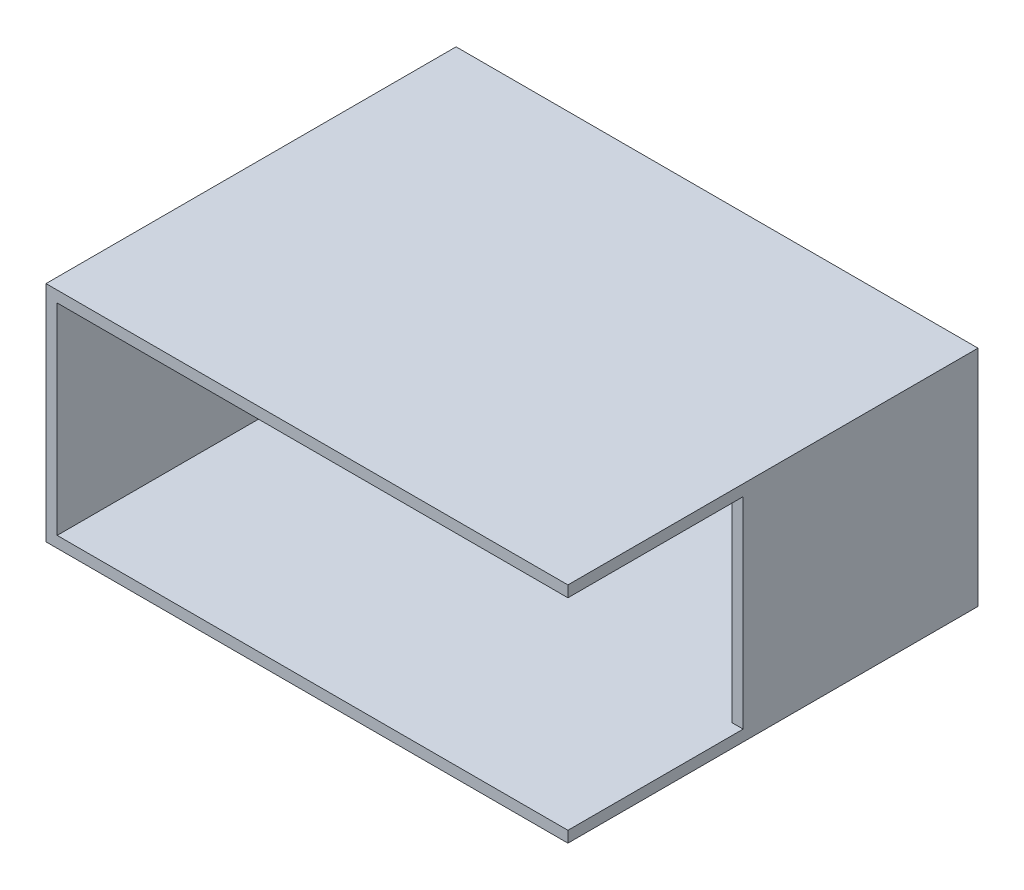
ISO-10303-21;
HEADER;
FILE_DESCRIPTION(('STEP AP214'),'2;1');
FILE_NAME('part.step','',(''),(''),'','','');
FILE_SCHEMA(('AUTOMOTIVE_DESIGN { 1 0 10303 214 1 1 1 1 }'));
ENDSEC;
DATA;
#1=APPLICATION_CONTEXT('core data for automotive mechanical design processes');
#2=APPLICATION_PROTOCOL_DEFINITION('international standard','automotive_design',2000,#1);
#3=PRODUCT_CONTEXT('',#1,'mechanical');
#4=PRODUCT('Part','Part','',(#3));
#5=PRODUCT_RELATED_PRODUCT_CATEGORY('part','',(#4));
#6=PRODUCT_DEFINITION_FORMATION('','',#4);
#7=PRODUCT_DEFINITION_CONTEXT('part definition',#1,'design');
#8=PRODUCT_DEFINITION('design','',#6,#7);
#9=PRODUCT_DEFINITION_SHAPE('','',#8);
#10=(LENGTH_UNIT() NAMED_UNIT(*) SI_UNIT(.MILLI.,.METRE.));
#11=(NAMED_UNIT(*) PLANE_ANGLE_UNIT() SI_UNIT($,.RADIAN.));
#12=(NAMED_UNIT(*) SI_UNIT($,.STERADIAN.) SOLID_ANGLE_UNIT());
#13=UNCERTAINTY_MEASURE_WITH_UNIT(LENGTH_MEASURE(1.E-05),#10,'distance_accuracy_value','');
#14=(GEOMETRIC_REPRESENTATION_CONTEXT(3) GLOBAL_UNCERTAINTY_ASSIGNED_CONTEXT((#13)) GLOBAL_UNIT_ASSIGNED_CONTEXT((#10,
#11,#12)) REPRESENTATION_CONTEXT('',''));
#15=CARTESIAN_POINT('',(0.,0.,0.));
#16=DIRECTION('',(0.,0.,1.));
#17=DIRECTION('',(1.,0.,0.));
#18=AXIS2_PLACEMENT_3D('',#15,#16,#17);
#19=CARTESIAN_POINT('',(3.81000000000001,3.80999999999999,139.7));
#20=DIRECTION('',(0.,-1.,0.));
#21=DIRECTION('',(0.,0.,-1.));
#22=AXIS2_PLACEMENT_3D('',#19,#20,#21);
#23=PLANE('',#22);
#24=DIRECTION('',(0.,0.,-1.));
#25=VECTOR('',#24,1.);
#26=CARTESIAN_POINT('',(173.99,3.81000000000001,80.01));
#27=LINE('',#26,#25);
#28=CARTESIAN_POINT('',(173.99,3.81,80.01));
#29=VERTEX_POINT('',#28);
#30=CARTESIAN_POINT('',(173.99,3.81000000000001,3.81));
#31=VERTEX_POINT('',#30);
#32=EDGE_CURVE('E160',#29,#31,#27,.T.);
#33=ORIENTED_EDGE('',*,*,#32,.T.);
#34=DIRECTION('',(1.,0.,0.));
#35=VECTOR('',#34,1.);
#36=CARTESIAN_POINT('',(3.81000000000001,3.81000000000001,3.81));
#37=LINE('',#36,#35);
#38=CARTESIAN_POINT('',(3.81000000000001,3.81000000000001,3.81));
#39=VERTEX_POINT('',#38);
#40=EDGE_CURVE('E147',#39,#31,#37,.T.);
#41=ORIENTED_EDGE('',*,*,#40,.F.);
#42=DIRECTION('',(0.,0.,-1.));
#43=VECTOR('',#42,1.);
#44=CARTESIAN_POINT('',(3.81000000000001,3.80999999999999,139.7));
#45=LINE('',#44,#43);
#46=CARTESIAN_POINT('',(3.81000000000001,3.80999999999999,139.7));
#47=VERTEX_POINT('',#46);
#48=EDGE_CURVE('E224',#47,#39,#45,.T.);
#49=ORIENTED_EDGE('',*,*,#48,.F.);
#50=DIRECTION('',(1.,0.,0.));
#51=VECTOR('',#50,1.);
#52=CARTESIAN_POINT('',(3.81000000000001,3.80999999999999,139.7));
#53=LINE('',#52,#51);
#54=CARTESIAN_POINT('',(177.8,3.80999999999999,139.7));
#55=VERTEX_POINT('',#54);
#56=EDGE_CURVE('E241',#47,#55,#53,.T.);
#57=ORIENTED_EDGE('',*,*,#56,.T.);
#58=DIRECTION('',(0.,0.,-1.));
#59=VECTOR('',#58,1.);
#60=CARTESIAN_POINT('',(177.8,3.80999999999999,139.7));
#61=LINE('',#60,#59);
#62=CARTESIAN_POINT('',(177.8,3.81,80.01));
#63=VERTEX_POINT('',#62);
#64=EDGE_CURVE('E68',#55,#63,#61,.T.);
#65=ORIENTED_EDGE('',*,*,#64,.T.);
#66=DIRECTION('',(1.,0.,0.));
#67=VECTOR('',#66,1.);
#68=CARTESIAN_POINT('',(177.8,3.81000000000001,80.01));
#69=LINE('',#68,#67);
#70=EDGE_CURVE('E63',#29,#63,#69,.T.);
#71=ORIENTED_EDGE('',*,*,#70,.F.);
#72=EDGE_LOOP('',(#33,#41,#49,#57,#65,#71));
#73=FACE_BOUND('',#72,.T.);
#74=ADVANCED_FACE('F47',(#73),#23,.F.);
#75=CARTESIAN_POINT('',(3.81000000000001,72.39,139.7));
#76=DIRECTION('',(0.,1.,0.));
#77=DIRECTION('',(0.,0.,1.));
#78=AXIS2_PLACEMENT_3D('',#75,#76,#77);
#79=PLANE('',#78);
#80=DIRECTION('',(0.,0.,-1.));
#81=VECTOR('',#80,1.);
#82=CARTESIAN_POINT('',(173.99,72.39,80.01));
#83=LINE('',#82,#81);
#84=CARTESIAN_POINT('',(173.99,72.39,80.01));
#85=VERTEX_POINT('',#84);
#86=CARTESIAN_POINT('',(173.99,72.39,3.81));
#87=VERTEX_POINT('',#86);
#88=EDGE_CURVE('E164',#85,#87,#83,.T.);
#89=ORIENTED_EDGE('',*,*,#88,.F.);
#90=DIRECTION('',(-1.,0.,0.));
#91=VECTOR('',#90,1.);
#92=CARTESIAN_POINT('',(177.8,72.39,80.01));
#93=LINE('',#92,#91);
#94=CARTESIAN_POINT('',(177.8,72.39,80.01));
#95=VERTEX_POINT('',#94);
#96=EDGE_CURVE('E173',#95,#85,#93,.T.);
#97=ORIENTED_EDGE('',*,*,#96,.F.);
#98=DIRECTION('',(0.,0.,1.));
#99=VECTOR('',#98,1.);
#100=CARTESIAN_POINT('',(177.8,72.39,139.7));
#101=LINE('',#100,#99);
#102=CARTESIAN_POINT('',(177.8,72.39,139.7));
#103=VERTEX_POINT('',#102);
#104=EDGE_CURVE('E227',#95,#103,#101,.T.);
#105=ORIENTED_EDGE('',*,*,#104,.T.);
#106=DIRECTION('',(1.,0.,0.));
#107=VECTOR('',#106,1.);
#108=CARTESIAN_POINT('',(3.81000000000001,72.39,139.7));
#109=LINE('',#108,#107);
#110=CARTESIAN_POINT('',(3.81000000000001,72.39,139.7));
#111=VERTEX_POINT('',#110);
#112=EDGE_CURVE('E245',#111,#103,#109,.T.);
#113=ORIENTED_EDGE('',*,*,#112,.F.);
#114=DIRECTION('',(0.,0.,1.));
#115=VECTOR('',#114,1.);
#116=CARTESIAN_POINT('',(3.81000000000001,72.39,139.7));
#117=LINE('',#116,#115);
#118=CARTESIAN_POINT('',(3.81000000000001,72.39,3.81));
#119=VERTEX_POINT('',#118);
#120=EDGE_CURVE('E230',#119,#111,#117,.T.);
#121=ORIENTED_EDGE('',*,*,#120,.F.);
#122=DIRECTION('',(1.,0.,0.));
#123=VECTOR('',#122,1.);
#124=CARTESIAN_POINT('',(3.81000000000001,72.39,3.81));
#125=LINE('',#124,#123);
#126=EDGE_CURVE('E156',#119,#87,#125,.T.);
#127=ORIENTED_EDGE('',*,*,#126,.T.);
#128=EDGE_LOOP('',(#89,#97,#105,#113,#121,#127));
#129=FACE_BOUND('',#128,.T.);
#130=ADVANCED_FACE('F321',(#129),#79,.F.);
#131=CARTESIAN_POINT('',(3.81000000000001,3.81000000000001,3.81));
#132=DIRECTION('',(0.,0.,-1.));
#133=DIRECTION('',(0.,1.,0.));
#134=AXIS2_PLACEMENT_3D('',#131,#132,#133);
#135=PLANE('',#134);
#136=DIRECTION('',(1.,0.,0.));
#137=VECTOR('',#136,1.);
#138=CARTESIAN_POINT('',(24.13,29.21,3.81));
#139=LINE('',#138,#137);
#140=CARTESIAN_POINT('',(24.13,29.21,3.81));
#141=VERTEX_POINT('',#140);
#142=CARTESIAN_POINT('',(168.91,29.21,3.81));
#143=VERTEX_POINT('',#142);
#144=EDGE_CURVE('E201',#141,#143,#139,.T.);
#145=ORIENTED_EDGE('',*,*,#144,.F.);
#146=DIRECTION('',(0.,-1.,0.));
#147=VECTOR('',#146,1.);
#148=CARTESIAN_POINT('',(24.13,29.21,3.81));
#149=LINE('',#148,#147);
#150=CARTESIAN_POINT('',(24.13,46.99,3.81));
#151=VERTEX_POINT('',#150);
#152=EDGE_CURVE('E180',#151,#141,#149,.T.);
#153=ORIENTED_EDGE('',*,*,#152,.F.);
#154=DIRECTION('',(-1.,0.,0.));
#155=VECTOR('',#154,1.);
#156=CARTESIAN_POINT('',(24.13,46.99,3.81));
#157=LINE('',#156,#155);
#158=CARTESIAN_POINT('',(168.91,46.99,3.81));
#159=VERTEX_POINT('',#158);
#160=EDGE_CURVE('E186',#159,#151,#157,.T.);
#161=ORIENTED_EDGE('',*,*,#160,.F.);
#162=DIRECTION('',(0.,1.,0.));
#163=VECTOR('',#162,1.);
#164=CARTESIAN_POINT('',(168.91,29.21,3.81));
#165=LINE('',#164,#163);
#166=EDGE_CURVE('E205',#143,#159,#165,.T.);
#167=ORIENTED_EDGE('',*,*,#166,.F.);
#168=EDGE_LOOP('',(#145,#153,#161,#167));
#169=FACE_BOUND('',#168,.T.);
#170=DIRECTION('',(0.,-1.,0.));
#171=VECTOR('',#170,1.);
#172=CARTESIAN_POINT('',(173.99,72.39,3.81));
#173=LINE('',#172,#171);
#174=EDGE_CURVE('E150',#87,#31,#173,.T.);
#175=ORIENTED_EDGE('',*,*,#174,.F.);
#176=ORIENTED_EDGE('',*,*,#126,.F.);
#177=DIRECTION('',(0.,1.,0.));
#178=VECTOR('',#177,1.);
#179=CARTESIAN_POINT('',(3.81000000000001,3.81000000000001,3.81));
#180=LINE('',#179,#178);
#181=EDGE_CURVE('E153',#39,#119,#180,.T.);
#182=ORIENTED_EDGE('',*,*,#181,.F.);
#183=ORIENTED_EDGE('',*,*,#40,.T.);
#184=EDGE_LOOP('',(#175,#176,#182,#183));
#185=FACE_BOUND('',#184,.T.);
#186=ADVANCED_FACE('F148',(#169,#185),#135,.F.);
#187=CARTESIAN_POINT('',(177.8,0.,0.));
#188=DIRECTION('',(0.,1.,0.));
#189=DIRECTION('',(0.,0.,1.));
#190=AXIS2_PLACEMENT_3D('',#187,#188,#189);
#191=PLANE('',#190);
#192=DIRECTION('',(0.,0.,-1.));
#193=VECTOR('',#192,1.);
#194=CARTESIAN_POINT('',(0.,0.,0.));
#195=LINE('',#194,#193);
#196=CARTESIAN_POINT('',(0.,0.,139.7));
#197=VERTEX_POINT('',#196);
#198=CARTESIAN_POINT('',(0.,0.,0.));
#199=VERTEX_POINT('',#198);
#200=EDGE_CURVE('E244',#197,#199,#195,.T.);
#201=ORIENTED_EDGE('',*,*,#200,.T.);
#202=DIRECTION('',(-1.,0.,0.));
#203=VECTOR('',#202,1.);
#204=CARTESIAN_POINT('',(177.8,0.,0.));
#205=LINE('',#204,#203);
#206=CARTESIAN_POINT('',(177.8,0.,0.));
#207=VERTEX_POINT('',#206);
#208=EDGE_CURVE('E11',#207,#199,#205,.T.);
#209=ORIENTED_EDGE('',*,*,#208,.F.);
#210=DIRECTION('',(0.,0.,-1.));
#211=VECTOR('',#210,1.);
#212=CARTESIAN_POINT('',(177.8,0.,0.));
#213=LINE('',#212,#211);
#214=CARTESIAN_POINT('',(177.8,0.,139.7));
#215=VERTEX_POINT('',#214);
#216=EDGE_CURVE('E251',#215,#207,#213,.T.);
#217=ORIENTED_EDGE('',*,*,#216,.F.);
#218=DIRECTION('',(-1.,0.,0.));
#219=VECTOR('',#218,1.);
#220=CARTESIAN_POINT('',(177.8,0.,139.7));
#221=LINE('',#220,#219);
#222=EDGE_CURVE('E267',#215,#197,#221,.T.);
#223=ORIENTED_EDGE('',*,*,#222,.T.);
#224=EDGE_LOOP('',(#201,#209,#217,#223));
#225=FACE_BOUND('',#224,.T.);
#226=ADVANCED_FACE('F49',(#225),#191,.F.);
#227=CARTESIAN_POINT('',(177.8,0.,0.));
#228=DIRECTION('',(0.,0.,1.));
#229=DIRECTION('',(1.,0.,0.));
#230=AXIS2_PLACEMENT_3D('',#227,#228,#229);
#231=PLANE('',#230);
#232=DIRECTION('',(0.,1.,0.));
#233=VECTOR('',#232,1.);
#234=CARTESIAN_POINT('',(0.,0.,0.));
#235=LINE('',#234,#233);
#236=CARTESIAN_POINT('',(0.,76.2,0.));
#237=VERTEX_POINT('',#236);
#238=EDGE_CURVE('E271',#199,#237,#235,.T.);
#239=ORIENTED_EDGE('',*,*,#238,.T.);
#240=DIRECTION('',(-1.,0.,0.));
#241=VECTOR('',#240,1.);
#242=CARTESIAN_POINT('',(177.8,76.2,0.));
#243=LINE('',#242,#241);
#244=CARTESIAN_POINT('',(177.8,76.2,0.));
#245=VERTEX_POINT('',#244);
#246=EDGE_CURVE('E56',#245,#237,#243,.T.);
#247=ORIENTED_EDGE('',*,*,#246,.F.);
#248=DIRECTION('',(0.,1.,0.));
#249=VECTOR('',#248,1.);
#250=CARTESIAN_POINT('',(177.8,0.,0.));
#251=LINE('',#250,#249);
#252=EDGE_CURVE('E255',#207,#245,#251,.T.);
#253=ORIENTED_EDGE('',*,*,#252,.F.);
#254=ORIENTED_EDGE('',*,*,#208,.T.);
#255=EDGE_LOOP('',(#239,#247,#253,#254));
#256=FACE_BOUND('',#255,.T.);
#257=ADVANCED_FACE('F351',(#256),#231,.F.);
#258=CARTESIAN_POINT('',(177.8,76.2,0.));
#259=DIRECTION('',(0.,-1.,0.));
#260=DIRECTION('',(0.,0.,-1.));
#261=AXIS2_PLACEMENT_3D('',#258,#259,#260);
#262=PLANE('',#261);
#263=DIRECTION('',(0.,0.,1.));
#264=VECTOR('',#263,1.);
#265=CARTESIAN_POINT('',(0.,76.2,0.));
#266=LINE('',#265,#264);
#267=CARTESIAN_POINT('',(0.,76.2,139.7));
#268=VERTEX_POINT('',#267);
#269=EDGE_CURVE('E274',#237,#268,#266,.T.);
#270=ORIENTED_EDGE('',*,*,#269,.T.);
#271=DIRECTION('',(-1.,0.,0.));
#272=VECTOR('',#271,1.);
#273=CARTESIAN_POINT('',(177.8,76.2,139.7));
#274=LINE('',#273,#272);
#275=CARTESIAN_POINT('',(177.8,76.2,139.7));
#276=VERTEX_POINT('',#275);
#277=EDGE_CURVE('E282',#276,#268,#274,.T.);
#278=ORIENTED_EDGE('',*,*,#277,.F.);
#279=DIRECTION('',(0.,0.,1.));
#280=VECTOR('',#279,1.);
#281=CARTESIAN_POINT('',(177.8,76.2,0.));
#282=LINE('',#281,#280);
#283=EDGE_CURVE('E259',#245,#276,#282,.T.);
#284=ORIENTED_EDGE('',*,*,#283,.F.);
#285=ORIENTED_EDGE('',*,*,#246,.T.);
#286=EDGE_LOOP('',(#270,#278,#284,#285));
#287=FACE_BOUND('',#286,.T.);
#288=ADVANCED_FACE('F291',(#287),#262,.F.);
#289=CARTESIAN_POINT('',(177.8,0.,139.7));
#290=DIRECTION('',(0.,0.,-1.));
#291=DIRECTION('',(-1.,0.,0.));
#292=AXIS2_PLACEMENT_3D('',#289,#290,#291);
#293=PLANE('',#292);
#294=DIRECTION('',(0.,-1.,0.));
#295=VECTOR('',#294,1.);
#296=CARTESIAN_POINT('',(177.8,0.,139.7));
#297=LINE('',#296,#295);
#298=EDGE_CURVE('E262',#55,#215,#297,.T.);
#299=ORIENTED_EDGE('',*,*,#298,.F.);
#300=ORIENTED_EDGE('',*,*,#56,.F.);
#301=DIRECTION('',(0.,-1.,0.));
#302=VECTOR('',#301,1.);
#303=CARTESIAN_POINT('',(3.81000000000001,3.80999999999999,139.7));
#304=LINE('',#303,#302);
#305=EDGE_CURVE('E157',#111,#47,#304,.T.);
#306=ORIENTED_EDGE('',*,*,#305,.F.);
#307=ORIENTED_EDGE('',*,*,#112,.T.);
#308=EDGE_CURVE('E263',#276,#103,#297,.T.);
#309=ORIENTED_EDGE('',*,*,#308,.F.);
#310=ORIENTED_EDGE('',*,*,#277,.T.);
#311=DIRECTION('',(0.,-1.,0.));
#312=VECTOR('',#311,1.);
#313=CARTESIAN_POINT('',(0.,0.,139.7));
#314=LINE('',#313,#312);
#315=EDGE_CURVE('E256',#268,#197,#314,.T.);
#316=ORIENTED_EDGE('',*,*,#315,.T.);
#317=ORIENTED_EDGE('',*,*,#222,.F.);
#318=EDGE_LOOP('',(#299,#300,#306,#307,#309,#310,#316,#317));
#319=FACE_BOUND('',#318,.T.);
#320=ADVANCED_FACE('F301',(#319),#293,.F.);
#321=CARTESIAN_POINT('',(177.8,0.,0.));
#322=DIRECTION('',(-1.,0.,0.));
#323=DIRECTION('',(0.,0.,1.));
#324=AXIS2_PLACEMENT_3D('',#321,#322,#323);
#325=PLANE('',#324);
#326=ORIENTED_EDGE('',*,*,#104,.F.);
#327=DIRECTION('',(0.,1.,0.));
#328=VECTOR('',#327,1.);
#329=CARTESIAN_POINT('',(177.8,72.39,80.01));
#330=LINE('',#329,#328);
#331=EDGE_CURVE('E169',#63,#95,#330,.T.);
#332=ORIENTED_EDGE('',*,*,#331,.F.);
#333=ORIENTED_EDGE('',*,*,#64,.F.);
#334=ORIENTED_EDGE('',*,*,#298,.T.);
#335=ORIENTED_EDGE('',*,*,#216,.T.);
#336=ORIENTED_EDGE('',*,*,#252,.T.);
#337=ORIENTED_EDGE('',*,*,#283,.T.);
#338=ORIENTED_EDGE('',*,*,#308,.T.);
#339=EDGE_LOOP('',(#326,#332,#333,#334,#335,#336,#337,#338));
#340=FACE_BOUND('',#339,.T.);
#341=ADVANCED_FACE('F308',(#340),#325,.F.);
#342=CARTESIAN_POINT('',(0.,0.,0.));
#343=DIRECTION('',(-1.,0.,0.));
#344=DIRECTION('',(0.,0.,1.));
#345=AXIS2_PLACEMENT_3D('',#342,#343,#344);
#346=PLANE('',#345);
#347=ORIENTED_EDGE('',*,*,#200,.F.);
#348=ORIENTED_EDGE('',*,*,#315,.F.);
#349=ORIENTED_EDGE('',*,*,#269,.F.);
#350=ORIENTED_EDGE('',*,*,#238,.F.);
#351=EDGE_LOOP('',(#347,#348,#349,#350));
#352=FACE_BOUND('',#351,.T.);
#353=ADVANCED_FACE('F297',(#352),#346,.T.);
#354=CARTESIAN_POINT('',(3.81000000000001,0.,0.));
#355=DIRECTION('',(1.,0.,0.));
#356=DIRECTION('',(0.,0.,-1.));
#357=AXIS2_PLACEMENT_3D('',#354,#355,#356);
#358=PLANE('',#357);
#359=ORIENTED_EDGE('',*,*,#48,.T.);
#360=ORIENTED_EDGE('',*,*,#181,.T.);
#361=ORIENTED_EDGE('',*,*,#120,.T.);
#362=ORIENTED_EDGE('',*,*,#305,.T.);
#363=EDGE_LOOP('',(#359,#360,#361,#362));
#364=FACE_BOUND('',#363,.T.);
#365=ADVANCED_FACE('F325',(#364),#358,.T.);
#366=CARTESIAN_POINT('',(24.13,29.21,2.54));
#367=DIRECTION('',(-1.,0.,0.));
#368=DIRECTION('',(0.,0.,1.));
#369=AXIS2_PLACEMENT_3D('',#366,#367,#368);
#370=PLANE('',#369);
#371=ORIENTED_EDGE('',*,*,#152,.T.);
#372=DIRECTION('',(0.,0.,1.));
#373=VECTOR('',#372,1.);
#374=CARTESIAN_POINT('',(24.13,29.21,2.54));
#375=LINE('',#374,#373);
#376=CARTESIAN_POINT('',(24.13,29.21,2.54));
#377=VERTEX_POINT('',#376);
#378=EDGE_CURVE('E198',#377,#141,#375,.T.);
#379=ORIENTED_EDGE('',*,*,#378,.F.);
#380=DIRECTION('',(0.,-1.,0.));
#381=VECTOR('',#380,1.);
#382=CARTESIAN_POINT('',(24.13,29.21,2.54));
#383=LINE('',#382,#381);
#384=CARTESIAN_POINT('',(24.13,46.99,2.54));
#385=VERTEX_POINT('',#384);
#386=EDGE_CURVE('E181',#385,#377,#383,.T.);
#387=ORIENTED_EDGE('',*,*,#386,.F.);
#388=DIRECTION('',(0.,0.,1.));
#389=VECTOR('',#388,1.);
#390=CARTESIAN_POINT('',(24.13,46.99,2.54));
#391=LINE('',#390,#389);
#392=EDGE_CURVE('E212',#385,#151,#391,.T.);
#393=ORIENTED_EDGE('',*,*,#392,.T.);
#394=EDGE_LOOP('',(#371,#379,#387,#393));
#395=FACE_BOUND('',#394,.T.);
#396=ADVANCED_FACE('F327',(#395),#370,.F.);
#397=CARTESIAN_POINT('',(24.13,46.99,2.54));
#398=DIRECTION('',(0.,1.,0.));
#399=DIRECTION('',(0.,0.,1.));
#400=AXIS2_PLACEMENT_3D('',#397,#398,#399);
#401=PLANE('',#400);
#402=ORIENTED_EDGE('',*,*,#160,.T.);
#403=ORIENTED_EDGE('',*,*,#392,.F.);
#404=DIRECTION('',(-1.,0.,0.));
#405=VECTOR('',#404,1.);
#406=CARTESIAN_POINT('',(24.13,46.99,2.54));
#407=LINE('',#406,#405);
#408=CARTESIAN_POINT('',(168.91,46.99,2.54));
#409=VERTEX_POINT('',#408);
#410=EDGE_CURVE('E194',#409,#385,#407,.T.);
#411=ORIENTED_EDGE('',*,*,#410,.F.);
#412=DIRECTION('',(0.,0.,1.));
#413=VECTOR('',#412,1.);
#414=CARTESIAN_POINT('',(168.91,46.99,2.54));
#415=LINE('',#414,#413);
#416=EDGE_CURVE('E215',#409,#159,#415,.T.);
#417=ORIENTED_EDGE('',*,*,#416,.T.);
#418=EDGE_LOOP('',(#402,#403,#411,#417));
#419=FACE_BOUND('',#418,.T.);
#420=ADVANCED_FACE('F333',(#419),#401,.F.);
#421=CARTESIAN_POINT('',(168.91,29.21,2.54));
#422=DIRECTION('',(1.,0.,0.));
#423=DIRECTION('',(0.,0.,-1.));
#424=AXIS2_PLACEMENT_3D('',#421,#422,#423);
#425=PLANE('',#424);
#426=ORIENTED_EDGE('',*,*,#166,.T.);
#427=ORIENTED_EDGE('',*,*,#416,.F.);
#428=DIRECTION('',(0.,1.,0.));
#429=VECTOR('',#428,1.);
#430=CARTESIAN_POINT('',(168.91,29.21,2.54));
#431=LINE('',#430,#429);
#432=CARTESIAN_POINT('',(168.91,29.21,2.54));
#433=VERTEX_POINT('',#432);
#434=EDGE_CURVE('E190',#433,#409,#431,.T.);
#435=ORIENTED_EDGE('',*,*,#434,.F.);
#436=DIRECTION('',(0.,0.,1.));
#437=VECTOR('',#436,1.);
#438=CARTESIAN_POINT('',(168.91,29.21,2.54));
#439=LINE('',#438,#437);
#440=EDGE_CURVE('E218',#433,#143,#439,.T.);
#441=ORIENTED_EDGE('',*,*,#440,.T.);
#442=EDGE_LOOP('',(#426,#427,#435,#441));
#443=FACE_BOUND('',#442,.T.);
#444=ADVANCED_FACE('F374',(#443),#425,.F.);
#445=CARTESIAN_POINT('',(24.13,29.21,2.54));
#446=DIRECTION('',(0.,-1.,0.));
#447=DIRECTION('',(0.,0.,-1.));
#448=AXIS2_PLACEMENT_3D('',#445,#446,#447);
#449=PLANE('',#448);
#450=ORIENTED_EDGE('',*,*,#144,.T.);
#451=ORIENTED_EDGE('',*,*,#440,.F.);
#452=DIRECTION('',(1.,0.,0.));
#453=VECTOR('',#452,1.);
#454=CARTESIAN_POINT('',(24.13,29.21,2.54));
#455=LINE('',#454,#453);
#456=EDGE_CURVE('E185',#377,#433,#455,.T.);
#457=ORIENTED_EDGE('',*,*,#456,.F.);
#458=ORIENTED_EDGE('',*,*,#378,.T.);
#459=EDGE_LOOP('',(#450,#451,#457,#458));
#460=FACE_BOUND('',#459,.T.);
#461=ADVANCED_FACE('F367',(#460),#449,.F.);
#462=CARTESIAN_POINT('',(0.,0.,2.54));
#463=DIRECTION('',(0.,0.,-1.));
#464=DIRECTION('',(-1.,0.,0.));
#465=AXIS2_PLACEMENT_3D('',#462,#463,#464);
#466=PLANE('',#465);
#467=ORIENTED_EDGE('',*,*,#386,.T.);
#468=ORIENTED_EDGE('',*,*,#456,.T.);
#469=ORIENTED_EDGE('',*,*,#434,.T.);
#470=ORIENTED_EDGE('',*,*,#410,.T.);
#471=EDGE_LOOP('',(#467,#468,#469,#470));
#472=FACE_BOUND('',#471,.T.);
#473=ADVANCED_FACE('F376',(#472),#466,.F.);
#474=CARTESIAN_POINT('',(173.99,72.39,80.01));
#475=DIRECTION('',(1.,0.,0.));
#476=DIRECTION('',(0.,0.,-1.));
#477=AXIS2_PLACEMENT_3D('',#474,#475,#476);
#478=PLANE('',#477);
#479=ORIENTED_EDGE('',*,*,#174,.T.);
#480=ORIENTED_EDGE('',*,*,#32,.F.);
#481=DIRECTION('',(0.,-1.,0.));
#482=VECTOR('',#481,1.);
#483=CARTESIAN_POINT('',(173.99,72.39,80.01));
#484=LINE('',#483,#482);
#485=EDGE_CURVE('E314',#85,#29,#484,.T.);
#486=ORIENTED_EDGE('',*,*,#485,.F.);
#487=ORIENTED_EDGE('',*,*,#88,.T.);
#488=EDGE_LOOP('',(#479,#480,#486,#487));
#489=FACE_BOUND('',#488,.T.);
#490=ADVANCED_FACE('F167',(#489),#478,.F.);
#491=CARTESIAN_POINT('',(0.,0.,80.01));
#492=DIRECTION('',(0.,0.,-1.));
#493=DIRECTION('',(-1.,0.,0.));
#494=AXIS2_PLACEMENT_3D('',#491,#492,#493);
#495=PLANE('',#494);
#496=ORIENTED_EDGE('',*,*,#331,.T.);
#497=ORIENTED_EDGE('',*,*,#96,.T.);
#498=ORIENTED_EDGE('',*,*,#485,.T.);
#499=ORIENTED_EDGE('',*,*,#70,.T.);
#500=EDGE_LOOP('',(#496,#497,#498,#499));
#501=FACE_BOUND('',#500,.T.);
#502=ADVANCED_FACE('F319',(#501),#495,.F.);
#503=CLOSED_SHELL('',(#74,#130,#186,#226,#257,#288,#320,#341,#353,#365,#396,#420,#444,#461,#473,
#490,#502));
#504=MANIFOLD_SOLID_BREP('B2',#503);
#505=ADVANCED_BREP_SHAPE_REPRESENTATION('',(#18,#504),#14);
#506=SHAPE_DEFINITION_REPRESENTATION(#9,#505);
ENDSEC;
END-ISO-10303-21;
